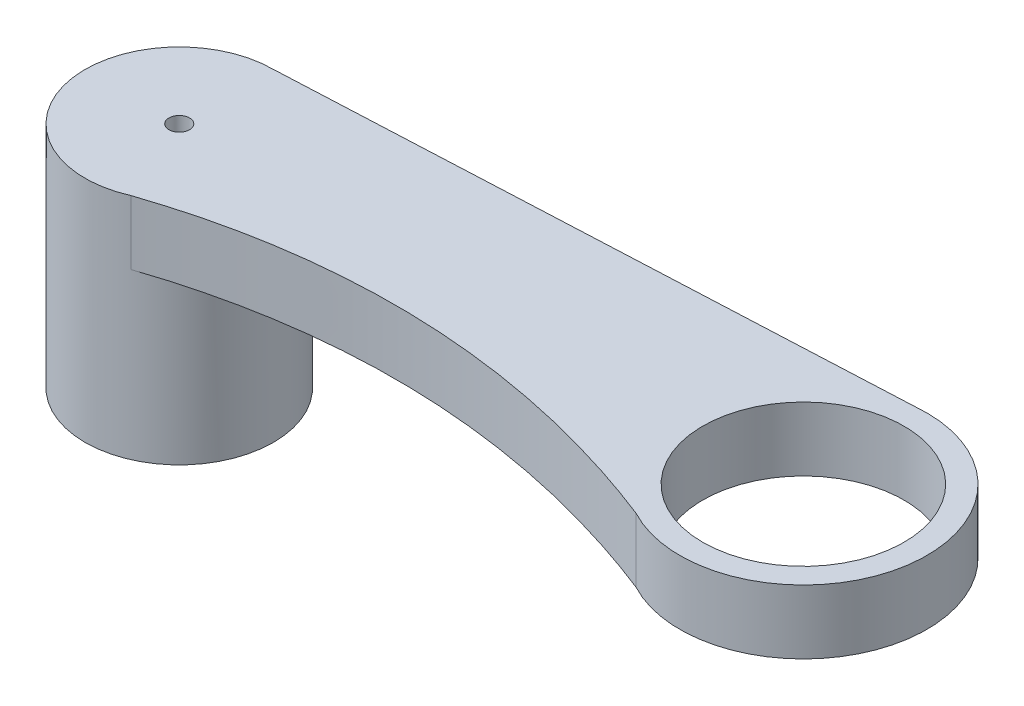
ISO-10303-21;
HEADER;
FILE_DESCRIPTION(('STEP AP214'),'2;1');
FILE_NAME('part.step','',(''),(''),'','','');
FILE_SCHEMA(('AUTOMOTIVE_DESIGN { 1 0 10303 214 1 1 1 1 }'));
ENDSEC;
DATA;
#1=APPLICATION_CONTEXT('core data for automotive mechanical design processes');
#2=APPLICATION_PROTOCOL_DEFINITION('international standard','automotive_design',2000,#1);
#3=PRODUCT_CONTEXT('',#1,'mechanical');
#4=PRODUCT('Part','Part','',(#3));
#5=PRODUCT_RELATED_PRODUCT_CATEGORY('part','',(#4));
#6=PRODUCT_DEFINITION_FORMATION('','',#4);
#7=PRODUCT_DEFINITION_CONTEXT('part definition',#1,'design');
#8=PRODUCT_DEFINITION('design','',#6,#7);
#9=PRODUCT_DEFINITION_SHAPE('','',#8);
#10=(LENGTH_UNIT() NAMED_UNIT(*) SI_UNIT(.MILLI.,.METRE.));
#11=(NAMED_UNIT(*) PLANE_ANGLE_UNIT() SI_UNIT($,.RADIAN.));
#12=(NAMED_UNIT(*) SI_UNIT($,.STERADIAN.) SOLID_ANGLE_UNIT());
#13=UNCERTAINTY_MEASURE_WITH_UNIT(LENGTH_MEASURE(1.E-05),#10,'distance_accuracy_value','');
#14=(GEOMETRIC_REPRESENTATION_CONTEXT(3) GLOBAL_UNCERTAINTY_ASSIGNED_CONTEXT((#13)) GLOBAL_UNIT_ASSIGNED_CONTEXT((#10,
#11,#12)) REPRESENTATION_CONTEXT('',''));
#15=CARTESIAN_POINT('',(0.,0.,0.));
#16=DIRECTION('',(0.,0.,1.));
#17=DIRECTION('',(1.,0.,0.));
#18=AXIS2_PLACEMENT_3D('',#15,#16,#17);
#19=CARTESIAN_POINT('',(0.,25.,0.));
#20=DIRECTION('',(0.,-1.,0.));
#21=DIRECTION('',(0.,0.,-1.));
#22=AXIS2_PLACEMENT_3D('',#19,#20,#21);
#23=CYLINDRICAL_SURFACE('',#22,10.3);
#24=CARTESIAN_POINT('',(0.,18.,0.));
#25=DIRECTION('',(0.,-1.,0.));
#26=DIRECTION('',(0.,0.,-1.));
#27=AXIS2_PLACEMENT_3D('',#24,#25,#26);
#28=CIRCLE('',#27,10.3);
#29=CARTESIAN_POINT('',(0.,18.,-10.3));
#30=VERTEX_POINT('',#29);
#31=CARTESIAN_POINT('',(4.16990453527767,18.,9.41816840827721));
#32=VERTEX_POINT('',#31);
#33=EDGE_CURVE('E105',#30,#32,#28,.T.);
#34=ORIENTED_EDGE('',*,*,#33,.T.);
#35=DIRECTION('',(0.,1.,0.));
#36=VECTOR('',#35,1.);
#37=CARTESIAN_POINT('',(4.16990453527767,18.,9.41816840827721));
#38=LINE('',#37,#36);
#39=CARTESIAN_POINT('',(4.16990453527767,25.,9.41816840827721));
#40=VERTEX_POINT('',#39);
#41=EDGE_CURVE('E68',#32,#40,#38,.T.);
#42=ORIENTED_EDGE('',*,*,#41,.T.);
#43=CARTESIAN_POINT('',(0.,25.,0.));
#44=DIRECTION('',(0.,1.,0.));
#45=DIRECTION('',(0.,0.,1.));
#46=AXIS2_PLACEMENT_3D('',#43,#44,#45);
#47=CIRCLE('',#46,10.3);
#48=CARTESIAN_POINT('',(0.,25.,-10.3));
#49=VERTEX_POINT('',#48);
#50=EDGE_CURVE('E11',#49,#40,#47,.T.);
#51=ORIENTED_EDGE('',*,*,#50,.F.);
#52=DIRECTION('',(0.,1.,0.));
#53=VECTOR('',#52,1.);
#54=CARTESIAN_POINT('',(0.,18.,-10.3));
#55=LINE('',#54,#53);
#56=EDGE_CURVE('E99',#30,#49,#55,.T.);
#57=ORIENTED_EDGE('',*,*,#56,.F.);
#58=EDGE_LOOP('',(#34,#42,#51,#57));
#59=FACE_BOUND('',#58,.T.);
#60=CARTESIAN_POINT('',(0.,0.,0.));
#61=DIRECTION('',(0.,1.,0.));
#62=DIRECTION('',(0.,0.,1.));
#63=AXIS2_PLACEMENT_3D('',#60,#61,#62);
#64=CIRCLE('',#63,10.3);
#65=CARTESIAN_POINT('',(0.,0.,10.3));
#66=VERTEX_POINT('',#65);
#67=EDGE_CURVE('E48',#66,#66,#64,.T.);
#68=ORIENTED_EDGE('',*,*,#67,.T.);
#69=EDGE_LOOP('',(#68));
#70=FACE_BOUND('',#69,.T.);
#71=ADVANCED_FACE('F45',(#59,#70),#23,.T.);
#72=CARTESIAN_POINT('',(0.,25.,0.));
#73=DIRECTION('',(0.,1.,0.));
#74=DIRECTION('',(0.,0.,1.));
#75=AXIS2_PLACEMENT_3D('',#72,#73,#74);
#76=PLANE('',#75);
#77=CARTESIAN_POINT('',(68.2073015610216,25.,0.));
#78=DIRECTION('',(0.,1.,0.));
#79=DIRECTION('',(0.,0.,1.));
#80=AXIS2_PLACEMENT_3D('',#77,#78,#79);
#81=CIRCLE('',#80,11.);
#82=CARTESIAN_POINT('',(68.2073015610216,25.,11.));
#83=VERTEX_POINT('',#82);
#84=EDGE_CURVE('E244',#83,#83,#81,.T.);
#85=ORIENTED_EDGE('',*,*,#84,.F.);
#86=EDGE_LOOP('',(#85));
#87=FACE_BOUND('',#86,.T.);
#88=CARTESIAN_POINT('',(0.,25.,0.));
#89=DIRECTION('',(0.,-1.,0.));
#90=DIRECTION('',(0.,0.,-1.));
#91=AXIS2_PLACEMENT_3D('',#88,#89,#90);
#92=CIRCLE('',#91,1.12499999999999);
#93=CARTESIAN_POINT('',(0.,25.,-1.12499999999999));
#94=VERTEX_POINT('',#93);
#95=EDGE_CURVE('E145',#94,#94,#92,.T.);
#96=ORIENTED_EDGE('',*,*,#95,.T.);
#97=EDGE_LOOP('',(#96));
#98=FACE_BOUND('',#97,.T.);
#99=ORIENTED_EDGE('',*,*,#50,.T.);
#100=CARTESIAN_POINT('',(4.16990453527767,25.,9.41816840827721));
#101=CARTESIAN_POINT('',(22.46177603715,25.,3.24596138026616));
#102=CARTESIAN_POINT('',(41.93415181531,25.,4.07724305719363));
#103=CARTESIAN_POINT('',(61.8200064973479,25.,11.8933789046499));
#104=B_SPLINE_CURVE_WITH_KNOTS('',3,(#100,#101,#102,#103),.UNSPECIFIED.,.F.,.F.,(4,4),(0.,1.),.UNSPECIFIED.);
#105=CARTESIAN_POINT('',(61.8200064973479,25.,11.8933789046499));
#106=VERTEX_POINT('',#105);
#107=EDGE_CURVE('E83',#40,#106,#104,.T.);
#108=ORIENTED_EDGE('',*,*,#107,.T.);
#109=CARTESIAN_POINT('',(68.2073015610216,25.,0.));
#110=DIRECTION('',(0.,1.,0.));
#111=DIRECTION('',(0.,0.,1.));
#112=AXIS2_PLACEMENT_3D('',#109,#110,#111);
#113=CIRCLE('',#112,13.5);
#114=CARTESIAN_POINT('',(66.9433570662362,25.,-13.4407010350689));
#115=VERTEX_POINT('',#114);
#116=EDGE_CURVE('E126',#106,#115,#113,.T.);
#117=ORIENTED_EDGE('',*,*,#116,.T.);
#118=DIRECTION('',(-0.998901267413146,0.,0.0468642503451384));
#119=VECTOR('',#118,1.);
#120=CARTESIAN_POINT('',(66.9433570662362,25.,-13.4407010350689));
#121=LINE('',#120,#119);
#122=EDGE_CURVE('E59',#115,#49,#121,.T.);
#123=ORIENTED_EDGE('',*,*,#122,.T.);
#124=EDGE_LOOP('',(#99,#108,#117,#123));
#125=FACE_BOUND('',#124,.T.);
#126=ADVANCED_FACE('F158',(#87,#98,#125),#76,.T.);
#127=CARTESIAN_POINT('',(0.,0.,0.));
#128=DIRECTION('',(0.,1.,0.));
#129=DIRECTION('',(0.,0.,1.));
#130=AXIS2_PLACEMENT_3D('',#127,#128,#129);
#131=PLANE('',#130);
#132=CARTESIAN_POINT('',(0.,0.,0.));
#133=DIRECTION('',(0.,-1.,0.));
#134=DIRECTION('',(0.,0.,-1.));
#135=AXIS2_PLACEMENT_3D('',#132,#133,#134);
#136=CIRCLE('',#135,1.125);
#137=CARTESIAN_POINT('',(0.,0.,-1.125));
#138=VERTEX_POINT('',#137);
#139=EDGE_CURVE('E137',#138,#138,#136,.T.);
#140=ORIENTED_EDGE('',*,*,#139,.F.);
#141=EDGE_LOOP('',(#140));
#142=FACE_BOUND('',#141,.T.);
#143=ORIENTED_EDGE('',*,*,#67,.F.);
#144=EDGE_LOOP('',(#143));
#145=FACE_BOUND('',#144,.T.);
#146=ADVANCED_FACE('F155',(#142,#145),#131,.F.);
#147=CARTESIAN_POINT('',(0.,0.,0.));
#148=DIRECTION('',(0.,-1.,0.));
#149=DIRECTION('',(0.,0.,-1.));
#150=AXIS2_PLACEMENT_3D('',#147,#148,#149);
#151=CYLINDRICAL_SURFACE('',#150,1.125);
#152=ORIENTED_EDGE('',*,*,#95,.F.);
#153=EDGE_LOOP('',(#152));
#154=FACE_BOUND('',#153,.T.);
#155=ORIENTED_EDGE('',*,*,#139,.T.);
#156=EDGE_LOOP('',(#155));
#157=FACE_BOUND('',#156,.T.);
#158=ADVANCED_FACE('F157',(#154,#157),#151,.F.);
#159=CARTESIAN_POINT('',(4.16990453527767,18.,9.41816840827721));
#160=CARTESIAN_POINT('',(22.46177603715,18.,3.24596138026616));
#161=CARTESIAN_POINT('',(41.93415181531,18.,4.07724305719363));
#162=CARTESIAN_POINT('',(61.8200064973479,18.,11.8933789046499));
#163=B_SPLINE_CURVE_WITH_KNOTS('',3,(#159,#160,#161,#162),.UNSPECIFIED.,.F.,.F.,(4,4),(0.,1.),.UNSPECIFIED.);
#164=DIRECTION('',(0.,1.,0.));
#165=VECTOR('',#164,1.);
#166=SURFACE_OF_LINEAR_EXTRUSION('',#163,#165);
#167=ORIENTED_EDGE('',*,*,#107,.F.);
#168=ORIENTED_EDGE('',*,*,#41,.F.);
#169=CARTESIAN_POINT('',(61.8200064973479,18.,11.8933789046499));
#170=VERTEX_POINT('',#169);
#171=EDGE_CURVE('E111',#32,#170,#163,.T.);
#172=ORIENTED_EDGE('',*,*,#171,.T.);
#173=DIRECTION('',(0.,1.,0.));
#174=VECTOR('',#173,1.);
#175=CARTESIAN_POINT('',(61.8200064973479,18.,11.8933789046499));
#176=LINE('',#175,#174);
#177=EDGE_CURVE('E89',#170,#106,#176,.T.);
#178=ORIENTED_EDGE('',*,*,#177,.T.);
#179=EDGE_LOOP('',(#167,#168,#172,#178));
#180=FACE_BOUND('',#179,.T.);
#181=ADVANCED_FACE('F163',(#180),#166,.T.);
#182=CARTESIAN_POINT('',(66.9433570662362,18.,-13.4407010350689));
#183=DIRECTION('',(-0.0468642503451384,0.,-0.998901267413145));
#184=DIRECTION('',(-0.998901267413146,0.,0.0468642503451384));
#185=AXIS2_PLACEMENT_3D('',#182,#183,#184);
#186=PLANE('',#185);
#187=ORIENTED_EDGE('',*,*,#122,.F.);
#188=DIRECTION('',(0.,1.,0.));
#189=VECTOR('',#188,1.);
#190=CARTESIAN_POINT('',(66.9433570662362,18.,-13.4407010350689));
#191=LINE('',#190,#189);
#192=CARTESIAN_POINT('',(66.9433570662362,18.,-13.4407010350689));
#193=VERTEX_POINT('',#192);
#194=EDGE_CURVE('E93',#193,#115,#191,.T.);
#195=ORIENTED_EDGE('',*,*,#194,.F.);
#196=DIRECTION('',(-0.998901267413146,0.,0.0468642503451384));
#197=VECTOR('',#196,1.);
#198=CARTESIAN_POINT('',(66.9433570662362,18.,-13.4407010350689));
#199=LINE('',#198,#197);
#200=EDGE_CURVE('E96',#193,#30,#199,.T.);
#201=ORIENTED_EDGE('',*,*,#200,.T.);
#202=ORIENTED_EDGE('',*,*,#56,.T.);
#203=EDGE_LOOP('',(#187,#195,#201,#202));
#204=FACE_BOUND('',#203,.T.);
#205=ADVANCED_FACE('F95',(#204),#186,.T.);
#206=CARTESIAN_POINT('',(68.2073015610216,18.,0.));
#207=DIRECTION('',(0.,1.,0.));
#208=DIRECTION('',(0.,0.,1.));
#209=AXIS2_PLACEMENT_3D('',#206,#207,#208);
#210=CYLINDRICAL_SURFACE('',#209,13.5);
#211=ORIENTED_EDGE('',*,*,#116,.F.);
#212=ORIENTED_EDGE('',*,*,#177,.F.);
#213=CARTESIAN_POINT('',(68.2073015610216,18.,0.));
#214=DIRECTION('',(0.,1.,0.));
#215=DIRECTION('',(0.,0.,1.));
#216=AXIS2_PLACEMENT_3D('',#213,#214,#215);
#217=CIRCLE('',#216,13.5);
#218=EDGE_CURVE('E103',#170,#193,#217,.T.);
#219=ORIENTED_EDGE('',*,*,#218,.T.);
#220=ORIENTED_EDGE('',*,*,#194,.T.);
#221=EDGE_LOOP('',(#211,#212,#219,#220));
#222=FACE_BOUND('',#221,.T.);
#223=ADVANCED_FACE('F109',(#222),#210,.T.);
#224=CARTESIAN_POINT('',(32.3972118237507,18.,5.41014507816331));
#225=DIRECTION('',(0.,1.,0.));
#226=DIRECTION('',(0.,0.,1.));
#227=AXIS2_PLACEMENT_3D('',#224,#225,#226);
#228=PLANE('',#227);
#229=CARTESIAN_POINT('',(68.2073015610216,18.,0.));
#230=DIRECTION('',(0.,1.,0.));
#231=DIRECTION('',(0.,0.,1.));
#232=AXIS2_PLACEMENT_3D('',#229,#230,#231);
#233=CIRCLE('',#232,11.);
#234=CARTESIAN_POINT('',(68.2073015610216,18.,11.));
#235=VERTEX_POINT('',#234);
#236=EDGE_CURVE('E127',#235,#235,#233,.T.);
#237=ORIENTED_EDGE('',*,*,#236,.T.);
#238=EDGE_LOOP('',(#237));
#239=FACE_BOUND('',#238,.T.);
#240=ORIENTED_EDGE('',*,*,#171,.F.);
#241=ORIENTED_EDGE('',*,*,#33,.F.);
#242=ORIENTED_EDGE('',*,*,#200,.F.);
#243=ORIENTED_EDGE('',*,*,#218,.F.);
#244=EDGE_LOOP('',(#240,#241,#242,#243));
#245=FACE_BOUND('',#244,.T.);
#246=ADVANCED_FACE('F102',(#239,#245),#228,.F.);
#247=CARTESIAN_POINT('',(68.2073015610216,25.,0.));
#248=DIRECTION('',(0.,1.,0.));
#249=DIRECTION('',(0.,0.,1.));
#250=AXIS2_PLACEMENT_3D('',#247,#248,#249);
#251=CYLINDRICAL_SURFACE('',#250,11.);
#252=ORIENTED_EDGE('',*,*,#84,.T.);
#253=EDGE_LOOP('',(#252));
#254=FACE_BOUND('',#253,.T.);
#255=ORIENTED_EDGE('',*,*,#236,.F.);
#256=EDGE_LOOP('',(#255));
#257=FACE_BOUND('',#256,.T.);
#258=ADVANCED_FACE('F210',(#254,#257),#251,.F.);
#259=CLOSED_SHELL('',(#71,#126,#146,#158,#181,#205,#223,#246,#258));
#260=MANIFOLD_SOLID_BREP('B2',#259);
#261=ADVANCED_BREP_SHAPE_REPRESENTATION('',(#18,#260),#14);
#262=SHAPE_DEFINITION_REPRESENTATION(#9,#261);
ENDSEC;
END-ISO-10303-21;
